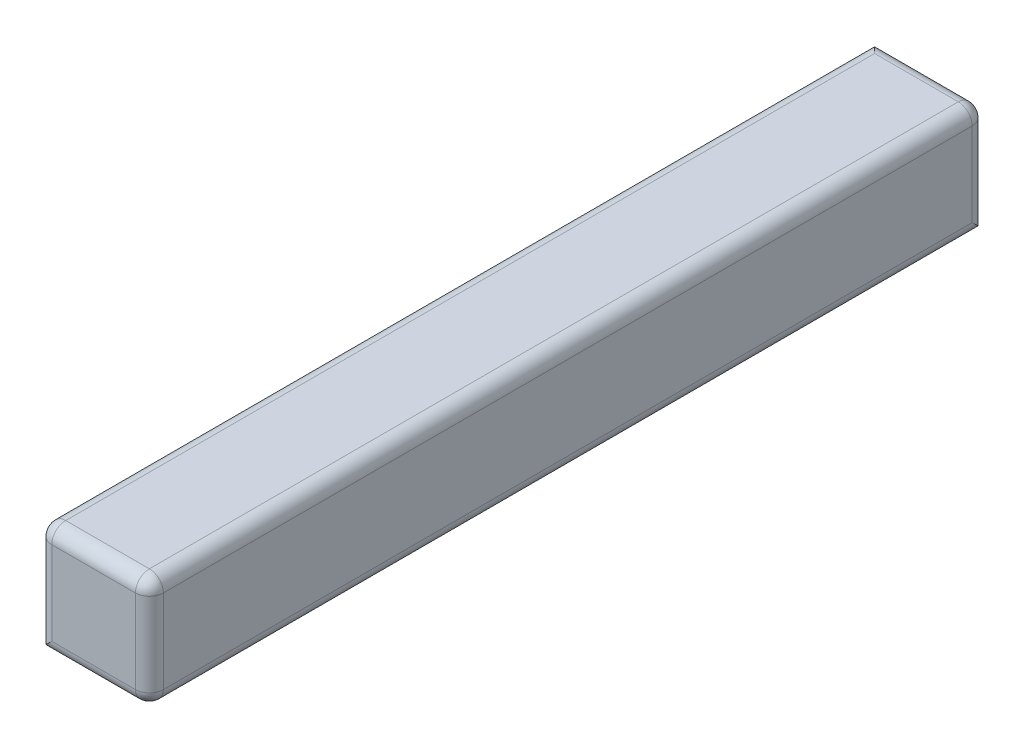
ISO-10303-21;
HEADER;
FILE_DESCRIPTION(('STEP AP214'),'2;1');
FILE_NAME('part.step','',(''),(''),'','','');
FILE_SCHEMA(('AUTOMOTIVE_DESIGN { 1 0 10303 214 1 1 1 1 }'));
ENDSEC;
DATA;
#1=APPLICATION_CONTEXT('core data for automotive mechanical design processes');
#2=APPLICATION_PROTOCOL_DEFINITION('international standard','automotive_design',2000,#1);
#3=PRODUCT_CONTEXT('',#1,'mechanical');
#4=PRODUCT('Part','Part','',(#3));
#5=PRODUCT_RELATED_PRODUCT_CATEGORY('part','',(#4));
#6=PRODUCT_DEFINITION_FORMATION('','',#4);
#7=PRODUCT_DEFINITION_CONTEXT('part definition',#1,'design');
#8=PRODUCT_DEFINITION('design','',#6,#7);
#9=PRODUCT_DEFINITION_SHAPE('','',#8);
#10=(LENGTH_UNIT() NAMED_UNIT(*) SI_UNIT(.MILLI.,.METRE.));
#11=(NAMED_UNIT(*) PLANE_ANGLE_UNIT() SI_UNIT($,.RADIAN.));
#12=(NAMED_UNIT(*) SI_UNIT($,.STERADIAN.) SOLID_ANGLE_UNIT());
#13=UNCERTAINTY_MEASURE_WITH_UNIT(LENGTH_MEASURE(1.E-05),#10,'distance_accuracy_value','');
#14=(GEOMETRIC_REPRESENTATION_CONTEXT(3) GLOBAL_UNCERTAINTY_ASSIGNED_CONTEXT((#13)) GLOBAL_UNIT_ASSIGNED_CONTEXT((#10,
#11,#12)) REPRESENTATION_CONTEXT('',''));
#15=CARTESIAN_POINT('',(0.,0.,0.));
#16=DIRECTION('',(0.,0.,1.));
#17=DIRECTION('',(1.,0.,0.));
#18=AXIS2_PLACEMENT_3D('',#15,#16,#17);
#19=CARTESIAN_POINT('',(-16.9667759319962,4.,-13.2926829268293));
#20=DIRECTION('',(1.,0.,0.));
#21=DIRECTION('',(0.,0.,-1.));
#22=AXIS2_PLACEMENT_3D('',#19,#20,#21);
#23=PLANE('',#22);
#24=DIRECTION('',(0.,-1.,0.));
#25=VECTOR('',#24,1.);
#26=CARTESIAN_POINT('',(-16.9667759319962,4.,16.2073170731707));
#27=LINE('',#26,#25);
#28=CARTESIAN_POINT('',(-16.9667759319962,0.,16.2073170731707));
#29=VERTEX_POINT('',#28);
#30=CARTESIAN_POINT('',(-16.9667759319962,3.5,16.2073170731707));
#31=VERTEX_POINT('',#30);
#32=EDGE_CURVE('E58',#29,#31,#27,.F.);
#33=ORIENTED_EDGE('',*,*,#32,.T.);
#34=DIRECTION('',(0.,0.,1.));
#35=VECTOR('',#34,1.);
#36=CARTESIAN_POINT('',(-16.9667759319962,3.5,-13.2926829268293));
#37=LINE('',#36,#35);
#38=CARTESIAN_POINT('',(-16.9667759319962,3.5,-13.2926829268293));
#39=VERTEX_POINT('',#38);
#40=EDGE_CURVE('E112',#31,#39,#37,.F.);
#41=ORIENTED_EDGE('',*,*,#40,.T.);
#42=DIRECTION('',(0.,-1.,0.));
#43=VECTOR('',#42,1.);
#44=CARTESIAN_POINT('',(-16.9667759319962,4.,-13.2926829268293));
#45=LINE('',#44,#43);
#46=CARTESIAN_POINT('',(-16.9667759319962,0.,-13.2926829268293));
#47=VERTEX_POINT('',#46);
#48=EDGE_CURVE('E108',#39,#47,#45,.T.);
#49=ORIENTED_EDGE('',*,*,#48,.T.);
#50=DIRECTION('',(0.,0.,1.));
#51=VECTOR('',#50,1.);
#52=CARTESIAN_POINT('',(-16.9667759319962,0.,-13.2926829268293));
#53=LINE('',#52,#51);
#54=EDGE_CURVE('E111',#47,#29,#53,.T.);
#55=ORIENTED_EDGE('',*,*,#54,.T.);
#56=EDGE_LOOP('',(#33,#41,#49,#55));
#57=FACE_BOUND('',#56,.T.);
#58=ADVANCED_FACE('F35',(#57),#23,.F.);
#59=CARTESIAN_POINT('',(-16.9667759319962,4.,16.7073170731707));
#60=DIRECTION('',(0.,0.,-1.));
#61=DIRECTION('',(-1.,0.,0.));
#62=AXIS2_PLACEMENT_3D('',#59,#60,#61);
#63=PLANE('',#62);
#64=DIRECTION('',(1.,0.,0.));
#65=VECTOR('',#64,1.);
#66=CARTESIAN_POINT('',(-16.9667759319962,0.5,16.7073170731707));
#67=LINE('',#66,#65);
#68=CARTESIAN_POINT('',(-16.4667759319962,0.5,16.7073170731707));
#69=VERTEX_POINT('',#68);
#70=CARTESIAN_POINT('',(-13.4667759319962,0.5,16.7073170731707));
#71=VERTEX_POINT('',#70);
#72=EDGE_CURVE('E133',#69,#71,#67,.T.);
#73=ORIENTED_EDGE('',*,*,#72,.T.);
#74=DIRECTION('',(0.,-1.,0.));
#75=VECTOR('',#74,1.);
#76=CARTESIAN_POINT('',(-13.4667759319962,4.,16.7073170731707));
#77=LINE('',#76,#75);
#78=CARTESIAN_POINT('',(-13.4667759319962,3.5,16.7073170731707));
#79=VERTEX_POINT('',#78);
#80=EDGE_CURVE('E136',#71,#79,#77,.F.);
#81=ORIENTED_EDGE('',*,*,#80,.T.);
#82=DIRECTION('',(1.,0.,0.));
#83=VECTOR('',#82,1.);
#84=CARTESIAN_POINT('',(-16.9667759319962,3.5,16.7073170731707));
#85=LINE('',#84,#83);
#86=CARTESIAN_POINT('',(-16.4667759319962,3.5,16.7073170731707));
#87=VERTEX_POINT('',#86);
#88=EDGE_CURVE('E131',#79,#87,#85,.F.);
#89=ORIENTED_EDGE('',*,*,#88,.T.);
#90=DIRECTION('',(0.,-1.,0.));
#91=VECTOR('',#90,1.);
#92=CARTESIAN_POINT('',(-16.4667759319962,4.,16.7073170731707));
#93=LINE('',#92,#91);
#94=EDGE_CURVE('E113',#87,#69,#93,.T.);
#95=ORIENTED_EDGE('',*,*,#94,.T.);
#96=EDGE_LOOP('',(#73,#81,#89,#95));
#97=FACE_BOUND('',#96,.T.);
#98=ADVANCED_FACE('F237',(#97),#63,.F.);
#99=CARTESIAN_POINT('',(-12.9667759319962,4.,-13.2926829268293));
#100=DIRECTION('',(-1.,0.,0.));
#101=DIRECTION('',(0.,0.,1.));
#102=AXIS2_PLACEMENT_3D('',#99,#100,#101);
#103=PLANE('',#102);
#104=DIRECTION('',(0.,0.,-1.));
#105=VECTOR('',#104,1.);
#106=CARTESIAN_POINT('',(-12.9667759319962,0.5,-13.2926829268293));
#107=LINE('',#106,#105);
#108=CARTESIAN_POINT('',(-12.9667759319962,0.5,16.2073170731707));
#109=VERTEX_POINT('',#108);
#110=CARTESIAN_POINT('',(-12.9667759319962,0.5,-12.7926829268293));
#111=VERTEX_POINT('',#110);
#112=EDGE_CURVE('E145',#109,#111,#107,.T.);
#113=ORIENTED_EDGE('',*,*,#112,.T.);
#114=DIRECTION('',(0.,-1.,0.));
#115=VECTOR('',#114,1.);
#116=CARTESIAN_POINT('',(-12.9667759319962,4.,-12.7926829268293));
#117=LINE('',#116,#115);
#118=CARTESIAN_POINT('',(-12.9667759319962,3.5,-12.7926829268293));
#119=VERTEX_POINT('',#118);
#120=EDGE_CURVE('E148',#111,#119,#117,.F.);
#121=ORIENTED_EDGE('',*,*,#120,.T.);
#122=DIRECTION('',(0.,0.,-1.));
#123=VECTOR('',#122,1.);
#124=CARTESIAN_POINT('',(-12.9667759319962,3.5,16.7073170731707));
#125=LINE('',#124,#123);
#126=CARTESIAN_POINT('',(-12.9667759319962,3.5,16.2073170731707));
#127=VERTEX_POINT('',#126);
#128=EDGE_CURVE('E143',#119,#127,#125,.F.);
#129=ORIENTED_EDGE('',*,*,#128,.T.);
#130=DIRECTION('',(0.,-1.,0.));
#131=VECTOR('',#130,1.);
#132=CARTESIAN_POINT('',(-12.9667759319962,4.,16.2073170731707));
#133=LINE('',#132,#131);
#134=EDGE_CURVE('E141',#127,#109,#133,.T.);
#135=ORIENTED_EDGE('',*,*,#134,.T.);
#136=EDGE_LOOP('',(#113,#121,#129,#135));
#137=FACE_BOUND('',#136,.T.);
#138=ADVANCED_FACE('F214',(#137),#103,.F.);
#139=CARTESIAN_POINT('',(-16.9667759319962,4.,-13.2926829268293));
#140=DIRECTION('',(0.,0.,1.));
#141=DIRECTION('',(1.,0.,0.));
#142=AXIS2_PLACEMENT_3D('',#139,#140,#141);
#143=PLANE('',#142);
#144=ORIENTED_EDGE('',*,*,#48,.F.);
#145=DIRECTION('',(-1.,0.,0.));
#146=VECTOR('',#145,1.);
#147=CARTESIAN_POINT('',(-12.9667759319962,3.5,-13.2926829268293));
#148=LINE('',#147,#146);
#149=CARTESIAN_POINT('',(-13.4667759319962,3.5,-13.2926829268293));
#150=VERTEX_POINT('',#149);
#151=EDGE_CURVE('E11',#39,#150,#148,.F.);
#152=ORIENTED_EDGE('',*,*,#151,.T.);
#153=DIRECTION('',(0.,-1.,0.));
#154=VECTOR('',#153,1.);
#155=CARTESIAN_POINT('',(-13.4667759319962,4.,-13.2926829268293));
#156=LINE('',#155,#154);
#157=CARTESIAN_POINT('',(-13.4667759319962,0.,-13.2926829268293));
#158=VERTEX_POINT('',#157);
#159=EDGE_CURVE('E44',#150,#158,#156,.T.);
#160=ORIENTED_EDGE('',*,*,#159,.T.);
#161=DIRECTION('',(-1.,0.,0.));
#162=VECTOR('',#161,1.);
#163=CARTESIAN_POINT('',(-16.9667759319962,0.,-13.2926829268293));
#164=LINE('',#163,#162);
#165=EDGE_CURVE('E114',#158,#47,#164,.T.);
#166=ORIENTED_EDGE('',*,*,#165,.T.);
#167=EDGE_LOOP('',(#144,#152,#160,#166));
#168=FACE_BOUND('',#167,.T.);
#169=ADVANCED_FACE('F117',(#168),#143,.F.);
#170=CARTESIAN_POINT('',(0.,4.,0.));
#171=DIRECTION('',(0.,1.,0.));
#172=DIRECTION('',(0.,0.,1.));
#173=AXIS2_PLACEMENT_3D('',#170,#171,#172);
#174=PLANE('',#173);
#175=DIRECTION('',(-1.,0.,0.));
#176=VECTOR('',#175,1.);
#177=CARTESIAN_POINT('',(-16.9667759319962,4.,-12.7926829268293));
#178=LINE('',#177,#176);
#179=CARTESIAN_POINT('',(-13.4667759319962,4.,-12.7926829268293));
#180=VERTEX_POINT('',#179);
#181=CARTESIAN_POINT('',(-16.4667759319962,4.,-12.7926829268293));
#182=VERTEX_POINT('',#181);
#183=EDGE_CURVE('E150',#180,#182,#178,.T.);
#184=ORIENTED_EDGE('',*,*,#183,.T.);
#185=DIRECTION('',(0.,0.,1.));
#186=VECTOR('',#185,1.);
#187=CARTESIAN_POINT('',(-16.4667759319962,4.,16.7073170731707));
#188=LINE('',#187,#186);
#189=CARTESIAN_POINT('',(-16.4667759319962,4.,16.2073170731707));
#190=VERTEX_POINT('',#189);
#191=EDGE_CURVE('E156',#182,#190,#188,.T.);
#192=ORIENTED_EDGE('',*,*,#191,.T.);
#193=DIRECTION('',(1.,0.,0.));
#194=VECTOR('',#193,1.);
#195=CARTESIAN_POINT('',(-12.9667759319962,4.,16.2073170731707));
#196=LINE('',#195,#194);
#197=CARTESIAN_POINT('',(-13.4667759319962,4.,16.2073170731707));
#198=VERTEX_POINT('',#197);
#199=EDGE_CURVE('E154',#190,#198,#196,.T.);
#200=ORIENTED_EDGE('',*,*,#199,.T.);
#201=DIRECTION('',(0.,0.,-1.));
#202=VECTOR('',#201,1.);
#203=CARTESIAN_POINT('',(-13.4667759319962,4.,-13.2926829268293));
#204=LINE('',#203,#202);
#205=EDGE_CURVE('E152',#198,#180,#204,.T.);
#206=ORIENTED_EDGE('',*,*,#205,.T.);
#207=EDGE_LOOP('',(#184,#192,#200,#206));
#208=FACE_BOUND('',#207,.T.);
#209=ADVANCED_FACE('F251',(#208),#174,.T.);
#210=CARTESIAN_POINT('',(0.,0.,0.));
#211=DIRECTION('',(0.,1.,0.));
#212=DIRECTION('',(0.,0.,1.));
#213=AXIS2_PLACEMENT_3D('',#210,#211,#212);
#214=PLANE('',#213);
#215=DIRECTION('',(0.,0.,-1.));
#216=VECTOR('',#215,1.);
#217=CARTESIAN_POINT('',(-13.4667759319962,0.,0.));
#218=LINE('',#217,#216);
#219=CARTESIAN_POINT('',(-13.4667759319962,0.,16.2073170731707));
#220=VERTEX_POINT('',#219);
#221=EDGE_CURVE('E138',#158,#220,#218,.F.);
#222=ORIENTED_EDGE('',*,*,#221,.T.);
#223=DIRECTION('',(1.,0.,0.));
#224=VECTOR('',#223,1.);
#225=CARTESIAN_POINT('',(0.,0.,16.2073170731707));
#226=LINE('',#225,#224);
#227=EDGE_CURVE('E125',#220,#29,#226,.F.);
#228=ORIENTED_EDGE('',*,*,#227,.T.);
#229=ORIENTED_EDGE('',*,*,#54,.F.);
#230=ORIENTED_EDGE('',*,*,#165,.F.);
#231=EDGE_LOOP('',(#222,#228,#229,#230));
#232=FACE_BOUND('',#231,.T.);
#233=ADVANCED_FACE('F123',(#232),#214,.F.);
#234=CARTESIAN_POINT('',(0.,3.5,-12.7926829268293));
#235=DIRECTION('',(1.,0.,0.));
#236=DIRECTION('',(0.,0.,-1.));
#237=AXIS2_PLACEMENT_3D('',#234,#235,#236);
#238=CYLINDRICAL_SURFACE('',#237,0.5);
#239=CARTESIAN_POINT('',(-16.4667759319962,3.5,-12.7926829268293));
#240=DIRECTION('',(0.707106781186547,0.,-0.707106781186548));
#241=DIRECTION('',(0.707106781186548,0.,0.707106781186547));
#242=AXIS2_PLACEMENT_3D('',#239,#240,#241);
#243=ELLIPSE('',#242,0.707106781186548,0.5);
#244=EDGE_CURVE('E194',#182,#39,#243,.F.);
#245=ORIENTED_EDGE('',*,*,#244,.F.);
#246=ORIENTED_EDGE('',*,*,#183,.F.);
#247=CARTESIAN_POINT('',(-13.4667759319962,3.5,-12.7926829268293));
#248=DIRECTION('',(1.,0.,0.));
#249=DIRECTION('',(0.,0.,-1.));
#250=AXIS2_PLACEMENT_3D('',#247,#248,#249);
#251=CIRCLE('',#250,0.5);
#252=EDGE_CURVE('E128',#150,#180,#251,.T.);
#253=ORIENTED_EDGE('',*,*,#252,.F.);
#254=ORIENTED_EDGE('',*,*,#151,.F.);
#255=EDGE_LOOP('',(#245,#246,#253,#254));
#256=FACE_BOUND('',#255,.T.);
#257=ADVANCED_FACE('F37',(#256),#238,.T.);
#258=CARTESIAN_POINT('',(-13.4667759319962,3.5,0.));
#259=DIRECTION('',(0.,0.,1.));
#260=DIRECTION('',(1.,0.,0.));
#261=AXIS2_PLACEMENT_3D('',#258,#259,#260);
#262=CYLINDRICAL_SURFACE('',#261,0.5);
#263=CARTESIAN_POINT('',(-13.4667759319962,3.5,-12.7926829268293));
#264=DIRECTION('',(0.,0.,-1.));
#265=DIRECTION('',(-1.,0.,0.));
#266=AXIS2_PLACEMENT_3D('',#263,#264,#265);
#267=CIRCLE('',#266,0.5);
#268=EDGE_CURVE('E39',#180,#119,#267,.T.);
#269=ORIENTED_EDGE('',*,*,#268,.F.);
#270=ORIENTED_EDGE('',*,*,#205,.F.);
#271=CARTESIAN_POINT('',(-13.4667759319962,3.5,16.2073170731707));
#272=DIRECTION('',(0.,0.,1.));
#273=DIRECTION('',(1.,0.,0.));
#274=AXIS2_PLACEMENT_3D('',#271,#272,#273);
#275=CIRCLE('',#274,0.5);
#276=EDGE_CURVE('E188',#127,#198,#275,.T.);
#277=ORIENTED_EDGE('',*,*,#276,.F.);
#278=ORIENTED_EDGE('',*,*,#128,.F.);
#279=EDGE_LOOP('',(#269,#270,#277,#278));
#280=FACE_BOUND('',#279,.T.);
#281=ADVANCED_FACE('F209',(#280),#262,.T.);
#282=CARTESIAN_POINT('',(-13.4667759319962,3.5,-12.7926829268293));
#283=DIRECTION('',(0.,0.,1.));
#284=DIRECTION('',(1.,0.,0.));
#285=AXIS2_PLACEMENT_3D('',#282,#283,#284);
#286=SPHERICAL_SURFACE('',#285,0.5);
#287=ORIENTED_EDGE('',*,*,#252,.T.);
#288=ORIENTED_EDGE('',*,*,#268,.T.);
#289=CARTESIAN_POINT('',(-13.4667759319962,3.5,-12.7926829268293));
#290=DIRECTION('',(0.,1.,0.));
#291=DIRECTION('',(0.,0.,1.));
#292=AXIS2_PLACEMENT_3D('',#289,#290,#291);
#293=CIRCLE('',#292,0.5);
#294=EDGE_CURVE('E185',#150,#119,#293,.F.);
#295=ORIENTED_EDGE('',*,*,#294,.F.);
#296=EDGE_LOOP('',(#287,#288,#295));
#297=FACE_BOUND('',#296,.T.);
#298=ADVANCED_FACE('F199',(#297),#286,.T.);
#299=CARTESIAN_POINT('',(-16.4667759319962,3.5,0.));
#300=DIRECTION('',(0.,0.,-1.));
#301=DIRECTION('',(-1.,0.,0.));
#302=AXIS2_PLACEMENT_3D('',#299,#300,#301);
#303=CYLINDRICAL_SURFACE('',#302,0.5);
#304=ORIENTED_EDGE('',*,*,#244,.T.);
#305=ORIENTED_EDGE('',*,*,#40,.F.);
#306=CARTESIAN_POINT('',(-16.4667759319962,3.5,16.2073170731707));
#307=DIRECTION('',(0.,0.,1.));
#308=DIRECTION('',(1.,0.,0.));
#309=AXIS2_PLACEMENT_3D('',#306,#307,#308);
#310=CIRCLE('',#309,0.5);
#311=EDGE_CURVE('E182',#190,#31,#310,.T.);
#312=ORIENTED_EDGE('',*,*,#311,.F.);
#313=ORIENTED_EDGE('',*,*,#191,.F.);
#314=EDGE_LOOP('',(#304,#305,#312,#313));
#315=FACE_BOUND('',#314,.T.);
#316=ADVANCED_FACE('F248',(#315),#303,.T.);
#317=CARTESIAN_POINT('',(0.,3.5,16.2073170731707));
#318=DIRECTION('',(-1.,0.,0.));
#319=DIRECTION('',(0.,0.,1.));
#320=AXIS2_PLACEMENT_3D('',#317,#318,#319);
#321=CYLINDRICAL_SURFACE('',#320,0.5);
#322=CARTESIAN_POINT('',(-13.4667759319962,3.5,16.2073170731707));
#323=DIRECTION('',(1.,0.,0.));
#324=DIRECTION('',(0.,0.,-1.));
#325=AXIS2_PLACEMENT_3D('',#322,#323,#324);
#326=CIRCLE('',#325,0.5);
#327=EDGE_CURVE('E191',#198,#79,#326,.T.);
#328=ORIENTED_EDGE('',*,*,#327,.F.);
#329=ORIENTED_EDGE('',*,*,#199,.F.);
#330=CARTESIAN_POINT('',(-16.4667759319962,3.5,16.2073170731707));
#331=DIRECTION('',(-1.,0.,0.));
#332=DIRECTION('',(0.,0.,1.));
#333=AXIS2_PLACEMENT_3D('',#330,#331,#332);
#334=CIRCLE('',#333,0.5);
#335=EDGE_CURVE('E180',#87,#190,#334,.T.);
#336=ORIENTED_EDGE('',*,*,#335,.F.);
#337=ORIENTED_EDGE('',*,*,#88,.F.);
#338=EDGE_LOOP('',(#328,#329,#336,#337));
#339=FACE_BOUND('',#338,.T.);
#340=ADVANCED_FACE('F250',(#339),#321,.T.);
#341=CARTESIAN_POINT('',(-13.4667759319962,3.5,16.2073170731707));
#342=DIRECTION('',(0.,0.,1.));
#343=DIRECTION('',(1.,0.,0.));
#344=AXIS2_PLACEMENT_3D('',#341,#342,#343);
#345=SPHERICAL_SURFACE('',#344,0.5);
#346=ORIENTED_EDGE('',*,*,#276,.T.);
#347=ORIENTED_EDGE('',*,*,#327,.T.);
#348=CARTESIAN_POINT('',(-13.4667759319962,3.5,16.2073170731707));
#349=DIRECTION('',(0.,1.,0.));
#350=DIRECTION('',(0.,0.,1.));
#351=AXIS2_PLACEMENT_3D('',#348,#349,#350);
#352=CIRCLE('',#351,0.5);
#353=EDGE_CURVE('E177',#127,#79,#352,.F.);
#354=ORIENTED_EDGE('',*,*,#353,.F.);
#355=EDGE_LOOP('',(#346,#347,#354));
#356=FACE_BOUND('',#355,.T.);
#357=ADVANCED_FACE('F282',(#356),#345,.T.);
#358=CARTESIAN_POINT('',(-13.4667759319962,4.,-12.7926829268293));
#359=DIRECTION('',(0.,-1.,0.));
#360=DIRECTION('',(0.,0.,-1.));
#361=AXIS2_PLACEMENT_3D('',#358,#359,#360);
#362=CYLINDRICAL_SURFACE('',#361,0.5);
#363=ORIENTED_EDGE('',*,*,#294,.T.);
#364=ORIENTED_EDGE('',*,*,#120,.F.);
#365=CARTESIAN_POINT('',(-13.4667759319962,0.5,-12.7926829268293));
#366=DIRECTION('',(0.,-0.707106781186547,0.707106781186547));
#367=DIRECTION('',(0.,-0.707106781186547,-0.707106781186547));
#368=AXIS2_PLACEMENT_3D('',#365,#366,#367);
#369=ELLIPSE('',#368,0.707106781186547,0.5);
#370=EDGE_CURVE('E175',#158,#111,#369,.T.);
#371=ORIENTED_EDGE('',*,*,#370,.F.);
#372=ORIENTED_EDGE('',*,*,#159,.F.);
#373=EDGE_LOOP('',(#363,#364,#371,#372));
#374=FACE_BOUND('',#373,.T.);
#375=ADVANCED_FACE('F219',(#374),#362,.T.);
#376=CARTESIAN_POINT('',(-16.4667759319962,3.5,16.2073170731707));
#377=DIRECTION('',(0.,0.,1.));
#378=DIRECTION('',(1.,0.,0.));
#379=AXIS2_PLACEMENT_3D('',#376,#377,#378);
#380=SPHERICAL_SURFACE('',#379,0.5);
#381=ORIENTED_EDGE('',*,*,#335,.T.);
#382=ORIENTED_EDGE('',*,*,#311,.T.);
#383=CARTESIAN_POINT('',(-16.4667759319962,3.5,16.2073170731707));
#384=DIRECTION('',(0.,1.,0.));
#385=DIRECTION('',(0.,0.,1.));
#386=AXIS2_PLACEMENT_3D('',#383,#384,#385);
#387=CIRCLE('',#386,0.5);
#388=EDGE_CURVE('E172',#87,#31,#387,.F.);
#389=ORIENTED_EDGE('',*,*,#388,.F.);
#390=EDGE_LOOP('',(#381,#382,#389));
#391=FACE_BOUND('',#390,.T.);
#392=ADVANCED_FACE('F244',(#391),#380,.T.);
#393=CARTESIAN_POINT('',(-13.4667759319962,4.,16.2073170731707));
#394=DIRECTION('',(0.,-1.,0.));
#395=DIRECTION('',(0.,0.,-1.));
#396=AXIS2_PLACEMENT_3D('',#393,#394,#395);
#397=CYLINDRICAL_SURFACE('',#396,0.5);
#398=ORIENTED_EDGE('',*,*,#353,.T.);
#399=ORIENTED_EDGE('',*,*,#80,.F.);
#400=CARTESIAN_POINT('',(-13.4667759319962,0.5,16.2073170731707));
#401=DIRECTION('',(0.,-1.,0.));
#402=DIRECTION('',(0.,0.,-1.));
#403=AXIS2_PLACEMENT_3D('',#400,#401,#402);
#404=CIRCLE('',#403,0.5);
#405=EDGE_CURVE('E169',#109,#71,#404,.T.);
#406=ORIENTED_EDGE('',*,*,#405,.F.);
#407=ORIENTED_EDGE('',*,*,#134,.F.);
#408=EDGE_LOOP('',(#398,#399,#406,#407));
#409=FACE_BOUND('',#408,.T.);
#410=ADVANCED_FACE('F234',(#409),#397,.T.);
#411=CARTESIAN_POINT('',(-13.4667759319962,0.5,-13.2926829268293));
#412=DIRECTION('',(0.,0.,-1.));
#413=DIRECTION('',(-1.,0.,0.));
#414=AXIS2_PLACEMENT_3D('',#411,#412,#413);
#415=CYLINDRICAL_SURFACE('',#414,0.5);
#416=ORIENTED_EDGE('',*,*,#370,.T.);
#417=ORIENTED_EDGE('',*,*,#112,.F.);
#418=CARTESIAN_POINT('',(-13.4667759319962,0.5,16.2073170731707));
#419=DIRECTION('',(0.,0.,1.));
#420=DIRECTION('',(1.,0.,0.));
#421=AXIS2_PLACEMENT_3D('',#418,#419,#420);
#422=CIRCLE('',#421,0.5);
#423=EDGE_CURVE('E166',#220,#109,#422,.T.);
#424=ORIENTED_EDGE('',*,*,#423,.F.);
#425=ORIENTED_EDGE('',*,*,#221,.F.);
#426=EDGE_LOOP('',(#416,#417,#424,#425));
#427=FACE_BOUND('',#426,.T.);
#428=ADVANCED_FACE('F223',(#427),#415,.T.);
#429=CARTESIAN_POINT('',(-16.4667759319962,4.,16.2073170731707));
#430=DIRECTION('',(0.,-1.,0.));
#431=DIRECTION('',(0.,0.,-1.));
#432=AXIS2_PLACEMENT_3D('',#429,#430,#431);
#433=CYLINDRICAL_SURFACE('',#432,0.5);
#434=ORIENTED_EDGE('',*,*,#388,.T.);
#435=ORIENTED_EDGE('',*,*,#32,.F.);
#436=CARTESIAN_POINT('',(-16.4667759319962,0.5,16.2073170731707));
#437=DIRECTION('',(0.707106781186547,-0.707106781186547,0.));
#438=DIRECTION('',(-0.707106781186547,-0.707106781186547,0.));
#439=AXIS2_PLACEMENT_3D('',#436,#437,#438);
#440=ELLIPSE('',#439,0.707106781186547,0.5);
#441=EDGE_CURVE('E164',#69,#29,#440,.T.);
#442=ORIENTED_EDGE('',*,*,#441,.F.);
#443=ORIENTED_EDGE('',*,*,#94,.F.);
#444=EDGE_LOOP('',(#434,#435,#442,#443));
#445=FACE_BOUND('',#444,.T.);
#446=ADVANCED_FACE('F241',(#445),#433,.T.);
#447=CARTESIAN_POINT('',(-13.4667759319962,0.5,16.2073170731707));
#448=DIRECTION('',(0.,0.,1.));
#449=DIRECTION('',(1.,0.,0.));
#450=AXIS2_PLACEMENT_3D('',#447,#448,#449);
#451=SPHERICAL_SURFACE('',#450,0.5);
#452=ORIENTED_EDGE('',*,*,#423,.T.);
#453=ORIENTED_EDGE('',*,*,#405,.T.);
#454=CARTESIAN_POINT('',(-13.4667759319962,0.5,16.2073170731707));
#455=DIRECTION('',(1.,0.,0.));
#456=DIRECTION('',(0.,0.,-1.));
#457=AXIS2_PLACEMENT_3D('',#454,#455,#456);
#458=CIRCLE('',#457,0.5);
#459=EDGE_CURVE('E162',#220,#71,#458,.F.);
#460=ORIENTED_EDGE('',*,*,#459,.F.);
#461=EDGE_LOOP('',(#452,#453,#460));
#462=FACE_BOUND('',#461,.T.);
#463=ADVANCED_FACE('F231',(#462),#451,.T.);
#464=CARTESIAN_POINT('',(-16.9667759319962,0.5,16.2073170731707));
#465=DIRECTION('',(1.,0.,0.));
#466=DIRECTION('',(0.,0.,-1.));
#467=AXIS2_PLACEMENT_3D('',#464,#465,#466);
#468=CYLINDRICAL_SURFACE('',#467,0.5);
#469=ORIENTED_EDGE('',*,*,#441,.T.);
#470=ORIENTED_EDGE('',*,*,#227,.F.);
#471=ORIENTED_EDGE('',*,*,#459,.T.);
#472=ORIENTED_EDGE('',*,*,#72,.F.);
#473=EDGE_LOOP('',(#469,#470,#471,#472));
#474=FACE_BOUND('',#473,.T.);
#475=ADVANCED_FACE('F228',(#474),#468,.T.);
#476=CLOSED_SHELL('',(#58,#98,#138,#169,#209,#233,#257,#281,#298,#316,#340,#357,#375,#392,#410,
#428,#446,#463,#475));
#477=MANIFOLD_SOLID_BREP('B2',#476);
#478=ADVANCED_BREP_SHAPE_REPRESENTATION('',(#18,#477),#14);
#479=SHAPE_DEFINITION_REPRESENTATION(#9,#478);
ENDSEC;
END-ISO-10303-21;
